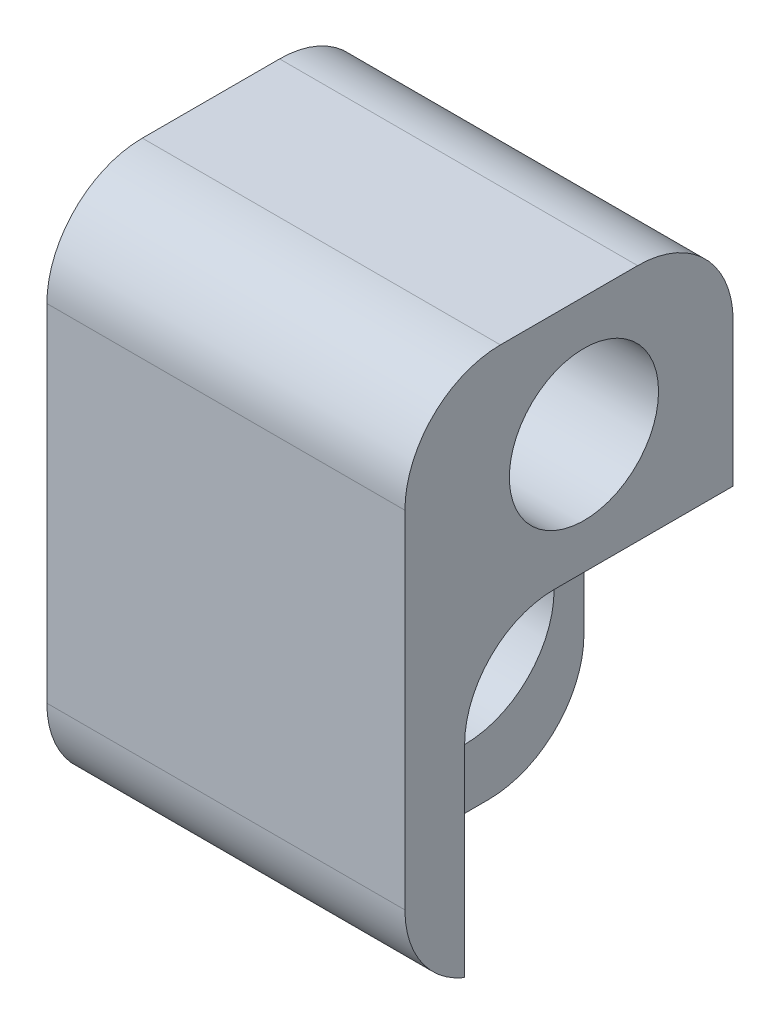
ISO-10303-21;
HEADER;
FILE_DESCRIPTION(('STEP AP214'),'2;1');
FILE_NAME('part.step','',(''),(''),'','','');
FILE_SCHEMA(('AUTOMOTIVE_DESIGN { 1 0 10303 214 1 1 1 1 }'));
ENDSEC;
DATA;
#1=APPLICATION_CONTEXT('core data for automotive mechanical design processes');
#2=APPLICATION_PROTOCOL_DEFINITION('international standard','automotive_design',2000,#1);
#3=PRODUCT_CONTEXT('',#1,'mechanical');
#4=PRODUCT('Part','Part','',(#3));
#5=PRODUCT_RELATED_PRODUCT_CATEGORY('part','',(#4));
#6=PRODUCT_DEFINITION_FORMATION('','',#4);
#7=PRODUCT_DEFINITION_CONTEXT('part definition',#1,'design');
#8=PRODUCT_DEFINITION('design','',#6,#7);
#9=PRODUCT_DEFINITION_SHAPE('','',#8);
#10=(LENGTH_UNIT() NAMED_UNIT(*) SI_UNIT(.MILLI.,.METRE.));
#11=(NAMED_UNIT(*) PLANE_ANGLE_UNIT() SI_UNIT($,.RADIAN.));
#12=(NAMED_UNIT(*) SI_UNIT($,.STERADIAN.) SOLID_ANGLE_UNIT());
#13=UNCERTAINTY_MEASURE_WITH_UNIT(LENGTH_MEASURE(1.E-05),#10,'distance_accuracy_value','');
#14=(GEOMETRIC_REPRESENTATION_CONTEXT(3) GLOBAL_UNCERTAINTY_ASSIGNED_CONTEXT((#13)) GLOBAL_UNIT_ASSIGNED_CONTEXT((#10,
#11,#12)) REPRESENTATION_CONTEXT('',''));
#15=CARTESIAN_POINT('',(0.,0.,0.));
#16=DIRECTION('',(0.,0.,1.));
#17=DIRECTION('',(1.,0.,0.));
#18=AXIS2_PLACEMENT_3D('',#15,#16,#17);
#19=CARTESIAN_POINT('',(6.,0.,0.));
#20=DIRECTION('',(-1.,0.,0.));
#21=DIRECTION('',(0.,0.,1.));
#22=AXIS2_PLACEMENT_3D('',#19,#20,#21);
#23=PLANE('',#22);
#24=DIRECTION('',(0.,0.,1.));
#25=VECTOR('',#24,1.);
#26=CARTESIAN_POINT('',(6.,9.,0.));
#27=LINE('',#26,#25);
#28=CARTESIAN_POINT('',(6.,9.,-3.9));
#29=VERTEX_POINT('',#28);
#30=CARTESIAN_POINT('',(6.,9.,-1.6));
#31=VERTEX_POINT('',#30);
#32=EDGE_CURVE('E172',#29,#31,#27,.T.);
#33=ORIENTED_EDGE('',*,*,#32,.T.);
#34=CARTESIAN_POINT('',(6.,7.4,-1.6));
#35=DIRECTION('',(-1.,0.,0.));
#36=DIRECTION('',(0.,0.,1.));
#37=AXIS2_PLACEMENT_3D('',#34,#35,#36);
#38=CIRCLE('',#37,1.6);
#39=CARTESIAN_POINT('',(6.,7.4,0.));
#40=VERTEX_POINT('',#39);
#41=EDGE_CURVE('E215',#31,#40,#38,.F.);
#42=ORIENTED_EDGE('',*,*,#41,.T.);
#43=DIRECTION('',(0.,-1.,0.));
#44=VECTOR('',#43,1.);
#45=CARTESIAN_POINT('',(6.,0.,0.));
#46=LINE('',#45,#44);
#47=CARTESIAN_POINT('',(6.,1.6,0.));
#48=VERTEX_POINT('',#47);
#49=EDGE_CURVE('E167',#40,#48,#46,.T.);
#50=ORIENTED_EDGE('',*,*,#49,.T.);
#51=CARTESIAN_POINT('',(6.,1.6,-1.6));
#52=DIRECTION('',(-1.,0.,0.));
#53=DIRECTION('',(0.,0.,1.));
#54=AXIS2_PLACEMENT_3D('',#51,#52,#53);
#55=CIRCLE('',#54,1.6);
#56=CARTESIAN_POINT('',(6.,0.116760302580867,-1.));
#57=VERTEX_POINT('',#56);
#58=EDGE_CURVE('E213',#48,#57,#55,.F.);
#59=ORIENTED_EDGE('',*,*,#58,.T.);
#60=DIRECTION('',(0.,-1.,0.));
#61=VECTOR('',#60,1.);
#62=CARTESIAN_POINT('',(6.,5.,-1.));
#63=LINE('',#62,#61);
#64=CARTESIAN_POINT('',(6.,3.5,-1.));
#65=VERTEX_POINT('',#64);
#66=EDGE_CURVE('E133',#65,#57,#63,.T.);
#67=ORIENTED_EDGE('',*,*,#66,.F.);
#68=CARTESIAN_POINT('',(6.,3.5,-2.5));
#69=DIRECTION('',(-1.,0.,0.));
#70=DIRECTION('',(0.,0.,1.));
#71=AXIS2_PLACEMENT_3D('',#68,#69,#70);
#72=CIRCLE('',#71,1.5);
#73=CARTESIAN_POINT('',(6.,5.,-2.5));
#74=VERTEX_POINT('',#73);
#75=EDGE_CURVE('E191',#65,#74,#72,.T.);
#76=ORIENTED_EDGE('',*,*,#75,.T.);
#77=DIRECTION('',(0.,0.,1.));
#78=VECTOR('',#77,1.);
#79=CARTESIAN_POINT('',(6.,5.,-5.5));
#80=LINE('',#79,#78);
#81=CARTESIAN_POINT('',(6.,5.,-5.5));
#82=VERTEX_POINT('',#81);
#83=EDGE_CURVE('E232',#82,#74,#80,.T.);
#84=ORIENTED_EDGE('',*,*,#83,.F.);
#85=DIRECTION('',(0.,1.,0.));
#86=VECTOR('',#85,1.);
#87=CARTESIAN_POINT('',(6.,0.,-5.5));
#88=LINE('',#87,#86);
#89=CARTESIAN_POINT('',(6.,7.4,-5.5));
#90=VERTEX_POINT('',#89);
#91=EDGE_CURVE('E147',#82,#90,#88,.T.);
#92=ORIENTED_EDGE('',*,*,#91,.T.);
#93=CARTESIAN_POINT('',(6.,7.4,-3.9));
#94=DIRECTION('',(-1.,0.,0.));
#95=DIRECTION('',(0.,0.,1.));
#96=AXIS2_PLACEMENT_3D('',#93,#94,#95);
#97=CIRCLE('',#96,1.6);
#98=EDGE_CURVE('E211',#90,#29,#97,.F.);
#99=ORIENTED_EDGE('',*,*,#98,.T.);
#100=EDGE_LOOP('',(#33,#42,#50,#59,#67,#76,#84,#92,#99));
#101=FACE_BOUND('',#100,.T.);
#102=CARTESIAN_POINT('',(6.,7.,-3.));
#103=DIRECTION('',(1.,0.,0.));
#104=DIRECTION('',(0.,0.,-1.));
#105=AXIS2_PLACEMENT_3D('',#102,#103,#104);
#106=CIRCLE('',#105,1.25);
#107=CARTESIAN_POINT('',(6.,7.,-4.25));
#108=VERTEX_POINT('',#107);
#109=EDGE_CURVE('E158',#108,#108,#106,.T.);
#110=ORIENTED_EDGE('',*,*,#109,.F.);
#111=EDGE_LOOP('',(#110));
#112=FACE_BOUND('',#111,.T.);
#113=ADVANCED_FACE('F35',(#101,#112),#23,.F.);
#114=CARTESIAN_POINT('',(0.,0.,0.));
#115=DIRECTION('',(-1.,0.,0.));
#116=DIRECTION('',(0.,0.,1.));
#117=AXIS2_PLACEMENT_3D('',#114,#115,#116);
#118=PLANE('',#117);
#119=CARTESIAN_POINT('',(0.,2.5,-3.5));
#120=DIRECTION('',(1.,0.,0.));
#121=DIRECTION('',(0.,0.,-1.));
#122=AXIS2_PLACEMENT_3D('',#119,#120,#121);
#123=CIRCLE('',#122,1.5);
#124=CARTESIAN_POINT('',(0.,2.5,-5.));
#125=VERTEX_POINT('',#124);
#126=EDGE_CURVE('E161',#125,#125,#123,.T.);
#127=ORIENTED_EDGE('',*,*,#126,.T.);
#128=EDGE_LOOP('',(#127));
#129=FACE_BOUND('',#128,.T.);
#130=DIRECTION('',(0.,-1.,0.));
#131=VECTOR('',#130,1.);
#132=CARTESIAN_POINT('',(0.,0.,0.));
#133=LINE('',#132,#131);
#134=CARTESIAN_POINT('',(0.,7.4,0.));
#135=VERTEX_POINT('',#134);
#136=CARTESIAN_POINT('',(0.,1.6,0.));
#137=VERTEX_POINT('',#136);
#138=EDGE_CURVE('E166',#135,#137,#133,.T.);
#139=ORIENTED_EDGE('',*,*,#138,.F.);
#140=CARTESIAN_POINT('',(0.,7.4,-1.6));
#141=DIRECTION('',(-1.,0.,0.));
#142=DIRECTION('',(0.,0.,1.));
#143=AXIS2_PLACEMENT_3D('',#140,#141,#142);
#144=CIRCLE('',#143,1.6);
#145=CARTESIAN_POINT('',(0.,9.,-1.6));
#146=VERTEX_POINT('',#145);
#147=EDGE_CURVE('E204',#135,#146,#144,.T.);
#148=ORIENTED_EDGE('',*,*,#147,.T.);
#149=DIRECTION('',(0.,0.,1.));
#150=VECTOR('',#149,1.);
#151=CARTESIAN_POINT('',(0.,9.,0.));
#152=LINE('',#151,#150);
#153=CARTESIAN_POINT('',(0.,9.,-3.9));
#154=VERTEX_POINT('',#153);
#155=EDGE_CURVE('E170',#154,#146,#152,.T.);
#156=ORIENTED_EDGE('',*,*,#155,.F.);
#157=CARTESIAN_POINT('',(0.,7.4,-3.9));
#158=DIRECTION('',(-1.,0.,0.));
#159=DIRECTION('',(0.,0.,1.));
#160=AXIS2_PLACEMENT_3D('',#157,#158,#159);
#161=CIRCLE('',#160,1.6);
#162=CARTESIAN_POINT('',(0.,7.4,-5.5));
#163=VERTEX_POINT('',#162);
#164=EDGE_CURVE('E198',#154,#163,#161,.T.);
#165=ORIENTED_EDGE('',*,*,#164,.T.);
#166=DIRECTION('',(0.,1.,0.));
#167=VECTOR('',#166,1.);
#168=CARTESIAN_POINT('',(0.,0.,-5.5));
#169=LINE('',#168,#167);
#170=CARTESIAN_POINT('',(0.,1.6,-5.5));
#171=VERTEX_POINT('',#170);
#172=EDGE_CURVE('E181',#171,#163,#169,.T.);
#173=ORIENTED_EDGE('',*,*,#172,.F.);
#174=CARTESIAN_POINT('',(0.,1.6,-3.9));
#175=DIRECTION('',(-1.,0.,0.));
#176=DIRECTION('',(0.,0.,1.));
#177=AXIS2_PLACEMENT_3D('',#174,#175,#176);
#178=CIRCLE('',#177,1.6);
#179=CARTESIAN_POINT('',(0.,0.,-3.9));
#180=VERTEX_POINT('',#179);
#181=EDGE_CURVE('E200',#171,#180,#178,.T.);
#182=ORIENTED_EDGE('',*,*,#181,.T.);
#183=DIRECTION('',(0.,0.,-1.));
#184=VECTOR('',#183,1.);
#185=CARTESIAN_POINT('',(0.,0.,0.));
#186=LINE('',#185,#184);
#187=CARTESIAN_POINT('',(0.,0.,-1.6));
#188=VERTEX_POINT('',#187);
#189=EDGE_CURVE('E178',#188,#180,#186,.T.);
#190=ORIENTED_EDGE('',*,*,#189,.F.);
#191=CARTESIAN_POINT('',(0.,1.6,-1.6));
#192=DIRECTION('',(-1.,0.,0.));
#193=DIRECTION('',(0.,0.,1.));
#194=AXIS2_PLACEMENT_3D('',#191,#192,#193);
#195=CIRCLE('',#194,1.6);
#196=EDGE_CURVE('E202',#188,#137,#195,.T.);
#197=ORIENTED_EDGE('',*,*,#196,.T.);
#198=EDGE_LOOP('',(#139,#148,#156,#165,#173,#182,#190,#197));
#199=FACE_BOUND('',#198,.T.);
#200=CARTESIAN_POINT('',(0.,7.,-3.));
#201=DIRECTION('',(1.,0.,0.));
#202=DIRECTION('',(0.,0.,-1.));
#203=AXIS2_PLACEMENT_3D('',#200,#201,#202);
#204=CIRCLE('',#203,1.25);
#205=CARTESIAN_POINT('',(0.,7.,-4.25));
#206=VERTEX_POINT('',#205);
#207=EDGE_CURVE('E152',#206,#206,#204,.T.);
#208=ORIENTED_EDGE('',*,*,#207,.T.);
#209=EDGE_LOOP('',(#208));
#210=FACE_BOUND('',#209,.T.);
#211=ADVANCED_FACE('F240',(#129,#199,#210),#118,.T.);
#212=CARTESIAN_POINT('',(6.,0.,0.));
#213=DIRECTION('',(0.,0.,-1.));
#214=DIRECTION('',(-1.,0.,0.));
#215=AXIS2_PLACEMENT_3D('',#212,#213,#214);
#216=PLANE('',#215);
#217=ORIENTED_EDGE('',*,*,#49,.F.);
#218=DIRECTION('',(-1.,0.,0.));
#219=VECTOR('',#218,1.);
#220=CARTESIAN_POINT('',(6.,7.4,0.));
#221=LINE('',#220,#219);
#222=EDGE_CURVE('E195',#40,#135,#221,.T.);
#223=ORIENTED_EDGE('',*,*,#222,.T.);
#224=ORIENTED_EDGE('',*,*,#138,.T.);
#225=DIRECTION('',(-1.,0.,0.));
#226=VECTOR('',#225,1.);
#227=CARTESIAN_POINT('',(6.,1.6,0.));
#228=LINE('',#227,#226);
#229=EDGE_CURVE('E193',#137,#48,#228,.F.);
#230=ORIENTED_EDGE('',*,*,#229,.T.);
#231=EDGE_LOOP('',(#217,#223,#224,#230));
#232=FACE_BOUND('',#231,.T.);
#233=ADVANCED_FACE('F248',(#232),#216,.F.);
#234=CARTESIAN_POINT('',(6.,0.,0.));
#235=DIRECTION('',(0.,1.,0.));
#236=DIRECTION('',(0.,0.,1.));
#237=AXIS2_PLACEMENT_3D('',#234,#235,#236);
#238=PLANE('',#237);
#239=DIRECTION('',(0.,0.,-1.));
#240=VECTOR('',#239,1.);
#241=CARTESIAN_POINT('',(3.5,0.,-5.5));
#242=LINE('',#241,#240);
#243=CARTESIAN_POINT('',(3.5,0.,-1.6));
#244=VERTEX_POINT('',#243);
#245=CARTESIAN_POINT('',(3.5,0.,-3.9));
#246=VERTEX_POINT('',#245);
#247=EDGE_CURVE('E149',#244,#246,#242,.T.);
#248=ORIENTED_EDGE('',*,*,#247,.F.);
#249=DIRECTION('',(-1.,0.,0.));
#250=VECTOR('',#249,1.);
#251=CARTESIAN_POINT('',(6.,0.,-1.6));
#252=LINE('',#251,#250);
#253=EDGE_CURVE('E219',#244,#188,#252,.T.);
#254=ORIENTED_EDGE('',*,*,#253,.T.);
#255=ORIENTED_EDGE('',*,*,#189,.T.);
#256=DIRECTION('',(-1.,0.,0.));
#257=VECTOR('',#256,1.);
#258=CARTESIAN_POINT('',(6.,0.,-3.9));
#259=LINE('',#258,#257);
#260=EDGE_CURVE('E217',#180,#246,#259,.F.);
#261=ORIENTED_EDGE('',*,*,#260,.T.);
#262=EDGE_LOOP('',(#248,#254,#255,#261));
#263=FACE_BOUND('',#262,.T.);
#264=ADVANCED_FACE('F258',(#263),#238,.F.);
#265=CARTESIAN_POINT('',(6.,0.,-5.5));
#266=DIRECTION('',(0.,0.,1.));
#267=DIRECTION('',(1.,0.,0.));
#268=AXIS2_PLACEMENT_3D('',#265,#266,#267);
#269=PLANE('',#268);
#270=DIRECTION('',(0.,1.,0.));
#271=VECTOR('',#270,1.);
#272=CARTESIAN_POINT('',(3.5,5.,-5.5));
#273=LINE('',#272,#271);
#274=CARTESIAN_POINT('',(3.5,1.6,-5.5));
#275=VERTEX_POINT('',#274);
#276=CARTESIAN_POINT('',(3.5,5.,-5.5));
#277=VERTEX_POINT('',#276);
#278=EDGE_CURVE('E125',#275,#277,#273,.T.);
#279=ORIENTED_EDGE('',*,*,#278,.F.);
#280=DIRECTION('',(-1.,0.,0.));
#281=VECTOR('',#280,1.);
#282=CARTESIAN_POINT('',(6.,1.6,-5.5));
#283=LINE('',#282,#281);
#284=EDGE_CURVE('E11',#275,#171,#283,.T.);
#285=ORIENTED_EDGE('',*,*,#284,.T.);
#286=ORIENTED_EDGE('',*,*,#172,.T.);
#287=DIRECTION('',(-1.,0.,0.));
#288=VECTOR('',#287,1.);
#289=CARTESIAN_POINT('',(6.,7.4,-5.5));
#290=LINE('',#289,#288);
#291=EDGE_CURVE('E43',#163,#90,#290,.F.);
#292=ORIENTED_EDGE('',*,*,#291,.T.);
#293=ORIENTED_EDGE('',*,*,#91,.F.);
#294=DIRECTION('',(1.,0.,0.));
#295=VECTOR('',#294,1.);
#296=CARTESIAN_POINT('',(3.5,5.,-5.5));
#297=LINE('',#296,#295);
#298=EDGE_CURVE('E138',#277,#82,#297,.T.);
#299=ORIENTED_EDGE('',*,*,#298,.F.);
#300=EDGE_LOOP('',(#279,#285,#286,#292,#293,#299));
#301=FACE_BOUND('',#300,.T.);
#302=ADVANCED_FACE('F145',(#301),#269,.F.);
#303=CARTESIAN_POINT('',(6.,9.,0.));
#304=DIRECTION('',(0.,-1.,0.));
#305=DIRECTION('',(0.,0.,-1.));
#306=AXIS2_PLACEMENT_3D('',#303,#304,#305);
#307=PLANE('',#306);
#308=ORIENTED_EDGE('',*,*,#155,.T.);
#309=DIRECTION('',(-1.,0.,0.));
#310=VECTOR('',#309,1.);
#311=CARTESIAN_POINT('',(6.,9.,-1.6));
#312=LINE('',#311,#310);
#313=EDGE_CURVE('E209',#146,#31,#312,.F.);
#314=ORIENTED_EDGE('',*,*,#313,.T.);
#315=ORIENTED_EDGE('',*,*,#32,.F.);
#316=DIRECTION('',(-1.,0.,0.));
#317=VECTOR('',#316,1.);
#318=CARTESIAN_POINT('',(6.,9.,-3.9));
#319=LINE('',#318,#317);
#320=EDGE_CURVE('E206',#29,#154,#319,.T.);
#321=ORIENTED_EDGE('',*,*,#320,.T.);
#322=EDGE_LOOP('',(#308,#314,#315,#321));
#323=FACE_BOUND('',#322,.T.);
#324=ADVANCED_FACE('F236',(#323),#307,.F.);
#325=CARTESIAN_POINT('',(6.,2.5,-3.5));
#326=DIRECTION('',(-1.,0.,0.));
#327=DIRECTION('',(0.,0.,1.));
#328=AXIS2_PLACEMENT_3D('',#325,#326,#327);
#329=CYLINDRICAL_SURFACE('',#328,1.5);
#330=CARTESIAN_POINT('',(3.5,2.5,-3.5));
#331=DIRECTION('',(-1.,0.,0.));
#332=DIRECTION('',(0.,0.,1.));
#333=AXIS2_PLACEMENT_3D('',#330,#331,#332);
#334=CIRCLE('',#333,1.5);
#335=CARTESIAN_POINT('',(3.5,2.5,-2.));
#336=VERTEX_POINT('',#335);
#337=EDGE_CURVE('E148',#336,#336,#334,.T.);
#338=ORIENTED_EDGE('',*,*,#337,.F.);
#339=EDGE_LOOP('',(#338));
#340=FACE_BOUND('',#339,.T.);
#341=ORIENTED_EDGE('',*,*,#126,.F.);
#342=EDGE_LOOP('',(#341));
#343=FACE_BOUND('',#342,.T.);
#344=ADVANCED_FACE('F277',(#340,#343),#329,.F.);
#345=CARTESIAN_POINT('',(6.,7.,-3.));
#346=DIRECTION('',(-1.,0.,0.));
#347=DIRECTION('',(0.,0.,1.));
#348=AXIS2_PLACEMENT_3D('',#345,#346,#347);
#349=CYLINDRICAL_SURFACE('',#348,1.25);
#350=ORIENTED_EDGE('',*,*,#109,.T.);
#351=EDGE_LOOP('',(#350));
#352=FACE_BOUND('',#351,.T.);
#353=ORIENTED_EDGE('',*,*,#207,.F.);
#354=EDGE_LOOP('',(#353));
#355=FACE_BOUND('',#354,.T.);
#356=ADVANCED_FACE('F344',(#352,#355),#349,.F.);
#357=CARTESIAN_POINT('',(3.5,5.,-1.));
#358=DIRECTION('',(0.,0.,1.));
#359=DIRECTION('',(0.,-1.,0.));
#360=AXIS2_PLACEMENT_3D('',#357,#358,#359);
#361=PLANE('',#360);
#362=ORIENTED_EDGE('',*,*,#66,.T.);
#363=DIRECTION('',(-1.,0.,0.));
#364=VECTOR('',#363,1.);
#365=CARTESIAN_POINT('',(6.,0.116760302580867,-1.));
#366=LINE('',#365,#364);
#367=CARTESIAN_POINT('',(3.5,0.116760302580867,-1.));
#368=VERTEX_POINT('',#367);
#369=EDGE_CURVE('E58',#57,#368,#366,.T.);
#370=ORIENTED_EDGE('',*,*,#369,.T.);
#371=DIRECTION('',(0.,-1.,0.));
#372=VECTOR('',#371,1.);
#373=CARTESIAN_POINT('',(3.5,5.,-1.));
#374=LINE('',#373,#372);
#375=CARTESIAN_POINT('',(3.5,3.5,-1.));
#376=VERTEX_POINT('',#375);
#377=EDGE_CURVE('E142',#376,#368,#374,.T.);
#378=ORIENTED_EDGE('',*,*,#377,.F.);
#379=DIRECTION('',(1.,0.,0.));
#380=VECTOR('',#379,1.);
#381=CARTESIAN_POINT('',(6.,3.5,-1.));
#382=LINE('',#381,#380);
#383=EDGE_CURVE('E175',#376,#65,#382,.T.);
#384=ORIENTED_EDGE('',*,*,#383,.T.);
#385=EDGE_LOOP('',(#362,#370,#378,#384));
#386=FACE_BOUND('',#385,.T.);
#387=ADVANCED_FACE('F336',(#386),#361,.F.);
#388=CARTESIAN_POINT('',(3.5,5.,-5.5));
#389=DIRECTION('',(0.,1.,0.));
#390=DIRECTION('',(0.,0.,1.));
#391=AXIS2_PLACEMENT_3D('',#388,#389,#390);
#392=PLANE('',#391);
#393=ORIENTED_EDGE('',*,*,#83,.T.);
#394=DIRECTION('',(1.,0.,0.));
#395=VECTOR('',#394,1.);
#396=CARTESIAN_POINT('',(3.5,5.,-2.5));
#397=LINE('',#396,#395);
#398=CARTESIAN_POINT('',(3.5,5.,-2.5));
#399=VERTEX_POINT('',#398);
#400=EDGE_CURVE('E141',#74,#399,#397,.F.);
#401=ORIENTED_EDGE('',*,*,#400,.T.);
#402=DIRECTION('',(0.,0.,1.));
#403=VECTOR('',#402,1.);
#404=CARTESIAN_POINT('',(3.5,5.,-5.5));
#405=LINE('',#404,#403);
#406=EDGE_CURVE('E128',#277,#399,#405,.T.);
#407=ORIENTED_EDGE('',*,*,#406,.F.);
#408=ORIENTED_EDGE('',*,*,#298,.T.);
#409=EDGE_LOOP('',(#393,#401,#407,#408));
#410=FACE_BOUND('',#409,.T.);
#411=ADVANCED_FACE('F137',(#410),#392,.F.);
#412=CARTESIAN_POINT('',(3.5,0.,0.));
#413=DIRECTION('',(-1.,0.,0.));
#414=DIRECTION('',(0.,0.,1.));
#415=AXIS2_PLACEMENT_3D('',#412,#413,#414);
#416=PLANE('',#415);
#417=ORIENTED_EDGE('',*,*,#337,.T.);
#418=EDGE_LOOP('',(#417));
#419=FACE_BOUND('',#418,.T.);
#420=ORIENTED_EDGE('',*,*,#377,.T.);
#421=CARTESIAN_POINT('',(3.5,1.6,-1.6));
#422=DIRECTION('',(-1.,0.,0.));
#423=DIRECTION('',(0.,0.,1.));
#424=AXIS2_PLACEMENT_3D('',#421,#422,#423);
#425=CIRCLE('',#424,1.6);
#426=EDGE_CURVE('E224',#368,#244,#425,.F.);
#427=ORIENTED_EDGE('',*,*,#426,.T.);
#428=ORIENTED_EDGE('',*,*,#247,.T.);
#429=CARTESIAN_POINT('',(3.5,1.6,-3.9));
#430=DIRECTION('',(-1.,0.,0.));
#431=DIRECTION('',(0.,0.,1.));
#432=AXIS2_PLACEMENT_3D('',#429,#430,#431);
#433=CIRCLE('',#432,1.6);
#434=EDGE_CURVE('E50',#246,#275,#433,.F.);
#435=ORIENTED_EDGE('',*,*,#434,.T.);
#436=ORIENTED_EDGE('',*,*,#278,.T.);
#437=ORIENTED_EDGE('',*,*,#406,.T.);
#438=CARTESIAN_POINT('',(3.5,3.5,-2.5));
#439=DIRECTION('',(-1.,0.,0.));
#440=DIRECTION('',(0.,0.,1.));
#441=AXIS2_PLACEMENT_3D('',#438,#439,#440);
#442=CIRCLE('',#441,1.5);
#443=EDGE_CURVE('E189',#399,#376,#442,.F.);
#444=ORIENTED_EDGE('',*,*,#443,.T.);
#445=EDGE_LOOP('',(#420,#427,#428,#435,#436,#437,#444));
#446=FACE_BOUND('',#445,.T.);
#447=ADVANCED_FACE('F127',(#419,#446),#416,.F.);
#448=CARTESIAN_POINT('',(3.5,3.5,-2.5));
#449=DIRECTION('',(-1.,0.,0.));
#450=DIRECTION('',(0.,0.,1.));
#451=AXIS2_PLACEMENT_3D('',#448,#449,#450);
#452=CYLINDRICAL_SURFACE('',#451,1.5);
#453=ORIENTED_EDGE('',*,*,#443,.F.);
#454=ORIENTED_EDGE('',*,*,#400,.F.);
#455=ORIENTED_EDGE('',*,*,#75,.F.);
#456=ORIENTED_EDGE('',*,*,#383,.F.);
#457=EDGE_LOOP('',(#453,#454,#455,#456));
#458=FACE_BOUND('',#457,.T.);
#459=ADVANCED_FACE('F288',(#458),#452,.F.);
#460=CARTESIAN_POINT('',(6.,7.4,-1.6));
#461=DIRECTION('',(-1.,0.,0.));
#462=DIRECTION('',(0.,0.,1.));
#463=AXIS2_PLACEMENT_3D('',#460,#461,#462);
#464=CYLINDRICAL_SURFACE('',#463,1.6);
#465=ORIENTED_EDGE('',*,*,#41,.F.);
#466=ORIENTED_EDGE('',*,*,#313,.F.);
#467=ORIENTED_EDGE('',*,*,#147,.F.);
#468=ORIENTED_EDGE('',*,*,#222,.F.);
#469=EDGE_LOOP('',(#465,#466,#467,#468));
#470=FACE_BOUND('',#469,.T.);
#471=ADVANCED_FACE('F245',(#470),#464,.T.);
#472=CARTESIAN_POINT('',(6.,1.6,-1.6));
#473=DIRECTION('',(-1.,0.,0.));
#474=DIRECTION('',(0.,0.,1.));
#475=AXIS2_PLACEMENT_3D('',#472,#473,#474);
#476=CYLINDRICAL_SURFACE('',#475,1.6);
#477=ORIENTED_EDGE('',*,*,#58,.F.);
#478=ORIENTED_EDGE('',*,*,#229,.F.);
#479=ORIENTED_EDGE('',*,*,#196,.F.);
#480=ORIENTED_EDGE('',*,*,#253,.F.);
#481=ORIENTED_EDGE('',*,*,#426,.F.);
#482=ORIENTED_EDGE('',*,*,#369,.F.);
#483=EDGE_LOOP('',(#477,#478,#479,#480,#481,#482));
#484=FACE_BOUND('',#483,.T.);
#485=ADVANCED_FACE('F253',(#484),#476,.T.);
#486=CARTESIAN_POINT('',(6.,1.6,-3.9));
#487=DIRECTION('',(-1.,0.,0.));
#488=DIRECTION('',(0.,0.,1.));
#489=AXIS2_PLACEMENT_3D('',#486,#487,#488);
#490=CYLINDRICAL_SURFACE('',#489,1.6);
#491=ORIENTED_EDGE('',*,*,#434,.F.);
#492=ORIENTED_EDGE('',*,*,#260,.F.);
#493=ORIENTED_EDGE('',*,*,#181,.F.);
#494=ORIENTED_EDGE('',*,*,#284,.F.);
#495=EDGE_LOOP('',(#491,#492,#493,#494));
#496=FACE_BOUND('',#495,.T.);
#497=ADVANCED_FACE('F262',(#496),#490,.T.);
#498=CARTESIAN_POINT('',(6.,7.4,-3.9));
#499=DIRECTION('',(-1.,0.,0.));
#500=DIRECTION('',(0.,0.,1.));
#501=AXIS2_PLACEMENT_3D('',#498,#499,#500);
#502=CYLINDRICAL_SURFACE('',#501,1.6);
#503=ORIENTED_EDGE('',*,*,#98,.F.);
#504=ORIENTED_EDGE('',*,*,#291,.F.);
#505=ORIENTED_EDGE('',*,*,#164,.F.);
#506=ORIENTED_EDGE('',*,*,#320,.F.);
#507=EDGE_LOOP('',(#503,#504,#505,#506));
#508=FACE_BOUND('',#507,.T.);
#509=ADVANCED_FACE('F37',(#508),#502,.T.);
#510=CLOSED_SHELL('',(#113,#211,#233,#264,#302,#324,#344,#356,#387,#411,#447,#459,#471,#485,
#497,#509));
#511=MANIFOLD_SOLID_BREP('B2',#510);
#512=ADVANCED_BREP_SHAPE_REPRESENTATION('',(#18,#511),#14);
#513=SHAPE_DEFINITION_REPRESENTATION(#9,#512);
ENDSEC;
END-ISO-10303-21;
